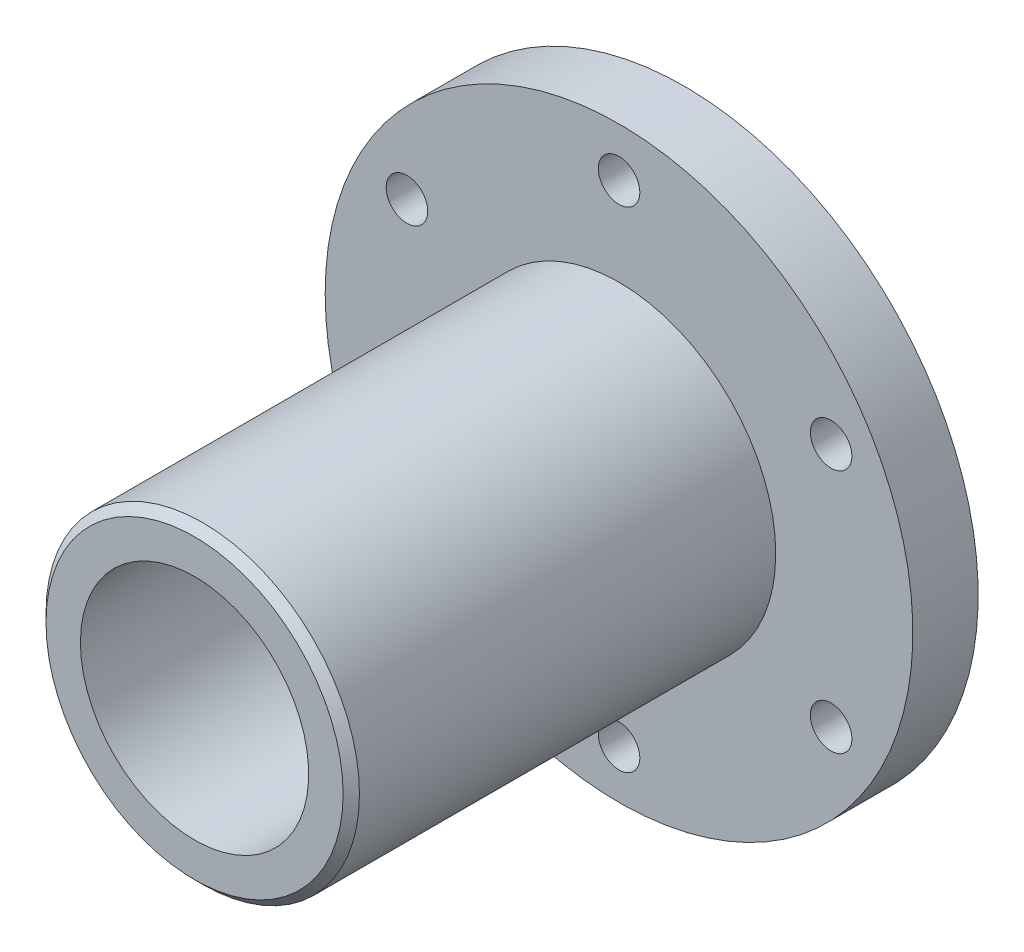
ISO-10303-21;
HEADER;
FILE_DESCRIPTION(('STEP AP214'),'2;1');
FILE_NAME('part.step','',(''),(''),'','','');
FILE_SCHEMA(('AUTOMOTIVE_DESIGN { 1 0 10303 214 1 1 1 1 }'));
ENDSEC;
DATA;
#1=APPLICATION_CONTEXT('core data for automotive mechanical design processes');
#2=APPLICATION_PROTOCOL_DEFINITION('international standard','automotive_design',2000,#1);
#3=PRODUCT_CONTEXT('',#1,'mechanical');
#4=PRODUCT('Part','Part','',(#3));
#5=PRODUCT_RELATED_PRODUCT_CATEGORY('part','',(#4));
#6=PRODUCT_DEFINITION_FORMATION('','',#4);
#7=PRODUCT_DEFINITION_CONTEXT('part definition',#1,'design');
#8=PRODUCT_DEFINITION('design','',#6,#7);
#9=PRODUCT_DEFINITION_SHAPE('','',#8);
#10=(LENGTH_UNIT() NAMED_UNIT(*) SI_UNIT(.MILLI.,.METRE.));
#11=(NAMED_UNIT(*) PLANE_ANGLE_UNIT() SI_UNIT($,.RADIAN.));
#12=(NAMED_UNIT(*) SI_UNIT($,.STERADIAN.) SOLID_ANGLE_UNIT());
#13=UNCERTAINTY_MEASURE_WITH_UNIT(LENGTH_MEASURE(1.E-05),#10,'distance_accuracy_value','');
#14=(GEOMETRIC_REPRESENTATION_CONTEXT(3) GLOBAL_UNCERTAINTY_ASSIGNED_CONTEXT((#13)) GLOBAL_UNIT_ASSIGNED_CONTEXT((#10,
#11,#12)) REPRESENTATION_CONTEXT('',''));
#15=CARTESIAN_POINT('',(0.,0.,0.));
#16=DIRECTION('',(0.,0.,1.));
#17=DIRECTION('',(1.,0.,0.));
#18=AXIS2_PLACEMENT_3D('',#15,#16,#17);
#19=CARTESIAN_POINT('',(0.,0.,43.65625));
#20=DIRECTION('',(0.,0.,-1.));
#21=DIRECTION('',(-1.,0.,0.));
#22=AXIS2_PLACEMENT_3D('',#19,#20,#21);
#23=CONICAL_SURFACE('',#22,15.24,0.785398163397449);
#24=CARTESIAN_POINT('',(0.,0.,43.65625));
#25=DIRECTION('',(0.,0.,-1.));
#26=DIRECTION('',(-1.,0.,0.));
#27=AXIS2_PLACEMENT_3D('',#24,#25,#26);
#28=CIRCLE('',#27,15.24);
#29=CARTESIAN_POINT('',(-15.24,0.,43.65625));
#30=VERTEX_POINT('',#29);
#31=EDGE_CURVE('E29',#30,#30,#28,.T.);
#32=ORIENTED_EDGE('',*,*,#31,.F.);
#33=EDGE_LOOP('',(#32));
#34=FACE_BOUND('',#33,.T.);
#35=CARTESIAN_POINT('',(0.,0.,44.45));
#36=DIRECTION('',(0.,0.,-1.));
#37=DIRECTION('',(-1.,0.,0.));
#38=AXIS2_PLACEMENT_3D('',#35,#36,#37);
#39=CIRCLE('',#38,14.44625);
#40=CARTESIAN_POINT('',(-14.44625,0.,44.45));
#41=VERTEX_POINT('',#40);
#42=EDGE_CURVE('E17',#41,#41,#39,.F.);
#43=ORIENTED_EDGE('',*,*,#42,.F.);
#44=EDGE_LOOP('',(#43));
#45=FACE_BOUND('',#44,.T.);
#46=ADVANCED_FACE('F14',(#34,#45),#23,.T.);
#47=CARTESIAN_POINT('',(0.,0.,44.45));
#48=DIRECTION('',(0.,0.,-1.));
#49=DIRECTION('',(-1.,0.,0.));
#50=AXIS2_PLACEMENT_3D('',#47,#48,#49);
#51=CYLINDRICAL_SURFACE('',#50,15.24);
#52=CARTESIAN_POINT('',(0.,0.,3.175));
#53=DIRECTION('',(0.,0.,-1.));
#54=DIRECTION('',(-1.,0.,0.));
#55=AXIS2_PLACEMENT_3D('',#52,#53,#54);
#56=CIRCLE('',#55,15.24);
#57=CARTESIAN_POINT('',(-15.24,0.,3.175));
#58=VERTEX_POINT('',#57);
#59=EDGE_CURVE('E71',#58,#58,#56,.T.);
#60=ORIENTED_EDGE('',*,*,#59,.F.);
#61=EDGE_LOOP('',(#60));
#62=FACE_BOUND('',#61,.T.);
#63=ORIENTED_EDGE('',*,*,#31,.T.);
#64=EDGE_LOOP('',(#63));
#65=FACE_BOUND('',#64,.T.);
#66=ADVANCED_FACE('F81',(#62,#65),#51,.T.);
#67=CARTESIAN_POINT('',(0.,0.,44.45));
#68=DIRECTION('',(0.,0.,1.));
#69=DIRECTION('',(1.,0.,0.));
#70=AXIS2_PLACEMENT_3D('',#67,#68,#69);
#71=PLANE('',#70);
#72=CARTESIAN_POINT('',(0.,0.,44.45));
#73=DIRECTION('',(0.,0.,-1.));
#74=DIRECTION('',(-1.,0.,0.));
#75=AXIS2_PLACEMENT_3D('',#72,#73,#74);
#76=CIRCLE('',#75,11.0998);
#77=CARTESIAN_POINT('',(-11.0998,0.,44.45));
#78=VERTEX_POINT('',#77);
#79=EDGE_CURVE('E63',#78,#78,#76,.T.);
#80=ORIENTED_EDGE('',*,*,#79,.T.);
#81=EDGE_LOOP('',(#80));
#82=FACE_BOUND('',#81,.T.);
#83=ORIENTED_EDGE('',*,*,#42,.T.);
#84=EDGE_LOOP('',(#83));
#85=FACE_BOUND('',#84,.T.);
#86=ADVANCED_FACE('F89',(#82,#85),#71,.T.);
#87=CARTESIAN_POINT('',(0.,0.,3.175));
#88=DIRECTION('',(0.,0.,1.));
#89=DIRECTION('',(1.,0.,0.));
#90=AXIS2_PLACEMENT_3D('',#87,#88,#89);
#91=PLANE('',#90);
#92=ORIENTED_EDGE('',*,*,#59,.T.);
#93=EDGE_LOOP('',(#92));
#94=FACE_BOUND('',#93,.T.);
#95=CARTESIAN_POINT('',(0.,0.,3.175));
#96=DIRECTION('',(0.,0.,-1.));
#97=DIRECTION('',(-1.,0.,0.));
#98=AXIS2_PLACEMENT_3D('',#95,#96,#97);
#99=CIRCLE('',#98,28.575);
#100=CARTESIAN_POINT('',(-28.575,0.,3.175));
#101=VERTEX_POINT('',#100);
#102=EDGE_CURVE('E60',#101,#101,#99,.T.);
#103=ORIENTED_EDGE('',*,*,#102,.F.);
#104=EDGE_LOOP('',(#103));
#105=FACE_BOUND('',#104,.T.);
#106=CARTESIAN_POINT('',(0.,23.8125,3.175));
#107=DIRECTION('',(0.,0.,-1.));
#108=DIRECTION('',(-1.,0.,0.));
#109=AXIS2_PLACEMENT_3D('',#106,#107,#108);
#110=CIRCLE('',#109,2.01929999999999);
#111=CARTESIAN_POINT('',(-2.01929999999999,23.8125,3.175));
#112=VERTEX_POINT('',#111);
#113=EDGE_CURVE('E57',#112,#112,#110,.T.);
#114=ORIENTED_EDGE('',*,*,#113,.T.);
#115=EDGE_LOOP('',(#114));
#116=FACE_BOUND('',#115,.T.);
#117=CARTESIAN_POINT('',(-20.622229927617,11.90625,3.175));
#118=DIRECTION('',(0.,0.,-1.));
#119=DIRECTION('',(-1.,0.,0.));
#120=AXIS2_PLACEMENT_3D('',#117,#118,#119);
#121=CIRCLE('',#120,2.01929999999999);
#122=CARTESIAN_POINT('',(-22.641529927617,11.90625,3.175));
#123=VERTEX_POINT('',#122);
#124=EDGE_CURVE('E54',#123,#123,#121,.T.);
#125=ORIENTED_EDGE('',*,*,#124,.T.);
#126=EDGE_LOOP('',(#125));
#127=FACE_BOUND('',#126,.T.);
#128=CARTESIAN_POINT('',(-20.6222299276169,-11.9062500000001,3.175));
#129=DIRECTION('',(0.,0.,-1.));
#130=DIRECTION('',(-1.,0.,0.));
#131=AXIS2_PLACEMENT_3D('',#128,#129,#130);
#132=CIRCLE('',#131,2.01929999999999);
#133=CARTESIAN_POINT('',(-22.6415299276169,-11.9062500000001,3.175));
#134=VERTEX_POINT('',#133);
#135=EDGE_CURVE('E51',#134,#134,#132,.T.);
#136=ORIENTED_EDGE('',*,*,#135,.T.);
#137=EDGE_LOOP('',(#136));
#138=FACE_BOUND('',#137,.T.);
#139=CARTESIAN_POINT('',(0.,-23.8125,3.175));
#140=DIRECTION('',(0.,0.,-1.));
#141=DIRECTION('',(-1.,0.,0.));
#142=AXIS2_PLACEMENT_3D('',#139,#140,#141);
#143=CIRCLE('',#142,2.01929999999999);
#144=CARTESIAN_POINT('',(-2.01929999999999,-23.8125,3.175));
#145=VERTEX_POINT('',#144);
#146=EDGE_CURVE('E48',#145,#145,#143,.T.);
#147=ORIENTED_EDGE('',*,*,#146,.T.);
#148=EDGE_LOOP('',(#147));
#149=FACE_BOUND('',#148,.T.);
#150=CARTESIAN_POINT('',(20.6222299276171,-11.9062499999998,3.175));
#151=DIRECTION('',(0.,0.,-1.));
#152=DIRECTION('',(-1.,0.,0.));
#153=AXIS2_PLACEMENT_3D('',#150,#151,#152);
#154=CIRCLE('',#153,2.01929999999999);
#155=CARTESIAN_POINT('',(18.6029299276171,-11.9062499999998,3.175));
#156=VERTEX_POINT('',#155);
#157=EDGE_CURVE('E66',#156,#156,#154,.T.);
#158=ORIENTED_EDGE('',*,*,#157,.T.);
#159=EDGE_LOOP('',(#158));
#160=FACE_BOUND('',#159,.T.);
#161=CARTESIAN_POINT('',(20.6222299276168,11.9062500000002,3.175));
#162=DIRECTION('',(0.,0.,-1.));
#163=DIRECTION('',(-1.,0.,0.));
#164=AXIS2_PLACEMENT_3D('',#161,#162,#163);
#165=CIRCLE('',#164,2.01929999999999);
#166=CARTESIAN_POINT('',(18.6029299276168,11.9062500000002,3.175));
#167=VERTEX_POINT('',#166);
#168=EDGE_CURVE('E69',#167,#167,#165,.T.);
#169=ORIENTED_EDGE('',*,*,#168,.T.);
#170=EDGE_LOOP('',(#169));
#171=FACE_BOUND('',#170,.T.);
#172=ADVANCED_FACE('F130',(#94,#105,#116,#127,#138,#149,#160,#171),#91,.T.);
#173=CARTESIAN_POINT('',(20.6222299276168,11.9062500000002,-3.175));
#174=DIRECTION('',(0.,0.,-1.));
#175=DIRECTION('',(-1.,0.,0.));
#176=AXIS2_PLACEMENT_3D('',#173,#174,#175);
#177=CYLINDRICAL_SURFACE('',#176,2.01929999999999);
#178=ORIENTED_EDGE('',*,*,#168,.F.);
#179=EDGE_LOOP('',(#178));
#180=FACE_BOUND('',#179,.T.);
#181=CARTESIAN_POINT('',(20.6222299276168,11.9062500000002,-3.175));
#182=DIRECTION('',(0.,0.,-1.));
#183=DIRECTION('',(-1.,0.,0.));
#184=AXIS2_PLACEMENT_3D('',#181,#182,#183);
#185=CIRCLE('',#184,2.01929999999999);
#186=CARTESIAN_POINT('',(18.6029299276168,11.9062500000002,-3.175));
#187=VERTEX_POINT('',#186);
#188=EDGE_CURVE('E45',#187,#187,#185,.T.);
#189=ORIENTED_EDGE('',*,*,#188,.T.);
#190=EDGE_LOOP('',(#189));
#191=FACE_BOUND('',#190,.T.);
#192=ADVANCED_FACE('F126',(#180,#191),#177,.F.);
#193=CARTESIAN_POINT('',(20.6222299276171,-11.9062499999998,-3.175));
#194=DIRECTION('',(0.,0.,-1.));
#195=DIRECTION('',(-1.,0.,0.));
#196=AXIS2_PLACEMENT_3D('',#193,#194,#195);
#197=CYLINDRICAL_SURFACE('',#196,2.01929999999999);
#198=ORIENTED_EDGE('',*,*,#157,.F.);
#199=EDGE_LOOP('',(#198));
#200=FACE_BOUND('',#199,.T.);
#201=CARTESIAN_POINT('',(20.6222299276171,-11.9062499999998,-3.175));
#202=DIRECTION('',(0.,0.,-1.));
#203=DIRECTION('',(-1.,0.,0.));
#204=AXIS2_PLACEMENT_3D('',#201,#202,#203);
#205=CIRCLE('',#204,2.01929999999999);
#206=CARTESIAN_POINT('',(18.6029299276171,-11.9062499999998,-3.175));
#207=VERTEX_POINT('',#206);
#208=EDGE_CURVE('E42',#207,#207,#205,.T.);
#209=ORIENTED_EDGE('',*,*,#208,.T.);
#210=EDGE_LOOP('',(#209));
#211=FACE_BOUND('',#210,.T.);
#212=ADVANCED_FACE('F122',(#200,#211),#197,.F.);
#213=CARTESIAN_POINT('',(0.,0.,3.175));
#214=DIRECTION('',(0.,0.,-1.));
#215=DIRECTION('',(-1.,0.,0.));
#216=AXIS2_PLACEMENT_3D('',#213,#214,#215);
#217=CYLINDRICAL_SURFACE('',#216,11.0998);
#218=CARTESIAN_POINT('',(0.,0.,-3.175));
#219=DIRECTION('',(0.,0.,-1.));
#220=DIRECTION('',(-1.,0.,0.));
#221=AXIS2_PLACEMENT_3D('',#218,#219,#220);
#222=CIRCLE('',#221,11.0998);
#223=CARTESIAN_POINT('',(-11.0998,0.,-3.175));
#224=VERTEX_POINT('',#223);
#225=EDGE_CURVE('E39',#224,#224,#222,.T.);
#226=ORIENTED_EDGE('',*,*,#225,.T.);
#227=EDGE_LOOP('',(#226));
#228=FACE_BOUND('',#227,.T.);
#229=ORIENTED_EDGE('',*,*,#79,.F.);
#230=EDGE_LOOP('',(#229));
#231=FACE_BOUND('',#230,.T.);
#232=ADVANCED_FACE('F118',(#228,#231),#217,.F.);
#233=CARTESIAN_POINT('',(0.,0.,3.175));
#234=DIRECTION('',(0.,0.,-1.));
#235=DIRECTION('',(-1.,0.,0.));
#236=AXIS2_PLACEMENT_3D('',#233,#234,#235);
#237=CYLINDRICAL_SURFACE('',#236,28.575);
#238=ORIENTED_EDGE('',*,*,#102,.T.);
#239=EDGE_LOOP('',(#238));
#240=FACE_BOUND('',#239,.T.);
#241=CARTESIAN_POINT('',(0.,0.,-3.175));
#242=DIRECTION('',(0.,0.,-1.));
#243=DIRECTION('',(-1.,0.,0.));
#244=AXIS2_PLACEMENT_3D('',#241,#242,#243);
#245=CIRCLE('',#244,28.575);
#246=CARTESIAN_POINT('',(-28.575,0.,-3.175));
#247=VERTEX_POINT('',#246);
#248=EDGE_CURVE('E36',#247,#247,#245,.F.);
#249=ORIENTED_EDGE('',*,*,#248,.T.);
#250=EDGE_LOOP('',(#249));
#251=FACE_BOUND('',#250,.T.);
#252=ADVANCED_FACE('F114',(#240,#251),#237,.T.);
#253=CARTESIAN_POINT('',(0.,23.8125,-3.175));
#254=DIRECTION('',(0.,0.,-1.));
#255=DIRECTION('',(-1.,0.,0.));
#256=AXIS2_PLACEMENT_3D('',#253,#254,#255);
#257=CYLINDRICAL_SURFACE('',#256,2.01929999999999);
#258=ORIENTED_EDGE('',*,*,#113,.F.);
#259=EDGE_LOOP('',(#258));
#260=FACE_BOUND('',#259,.T.);
#261=CARTESIAN_POINT('',(0.,23.8125,-3.175));
#262=DIRECTION('',(0.,0.,-1.));
#263=DIRECTION('',(-1.,0.,0.));
#264=AXIS2_PLACEMENT_3D('',#261,#262,#263);
#265=CIRCLE('',#264,2.01929999999999);
#266=CARTESIAN_POINT('',(-2.01929999999999,23.8125,-3.175));
#267=VERTEX_POINT('',#266);
#268=EDGE_CURVE('E33',#267,#267,#265,.T.);
#269=ORIENTED_EDGE('',*,*,#268,.T.);
#270=EDGE_LOOP('',(#269));
#271=FACE_BOUND('',#270,.T.);
#272=ADVANCED_FACE('F110',(#260,#271),#257,.F.);
#273=CARTESIAN_POINT('',(-20.622229927617,11.90625,-3.175));
#274=DIRECTION('',(0.,0.,-1.));
#275=DIRECTION('',(-1.,0.,0.));
#276=AXIS2_PLACEMENT_3D('',#273,#274,#275);
#277=CYLINDRICAL_SURFACE('',#276,2.01929999999999);
#278=ORIENTED_EDGE('',*,*,#124,.F.);
#279=EDGE_LOOP('',(#278));
#280=FACE_BOUND('',#279,.T.);
#281=CARTESIAN_POINT('',(-20.622229927617,11.90625,-3.175));
#282=DIRECTION('',(0.,0.,-1.));
#283=DIRECTION('',(-1.,0.,0.));
#284=AXIS2_PLACEMENT_3D('',#281,#282,#283);
#285=CIRCLE('',#284,2.01929999999999);
#286=CARTESIAN_POINT('',(-22.641529927617,11.90625,-3.175));
#287=VERTEX_POINT('',#286);
#288=EDGE_CURVE('E26',#287,#287,#285,.T.);
#289=ORIENTED_EDGE('',*,*,#288,.T.);
#290=EDGE_LOOP('',(#289));
#291=FACE_BOUND('',#290,.T.);
#292=ADVANCED_FACE('F106',(#280,#291),#277,.F.);
#293=CARTESIAN_POINT('',(-20.6222299276169,-11.9062500000001,-3.175));
#294=DIRECTION('',(0.,0.,-1.));
#295=DIRECTION('',(-1.,0.,0.));
#296=AXIS2_PLACEMENT_3D('',#293,#294,#295);
#297=CYLINDRICAL_SURFACE('',#296,2.01929999999999);
#298=ORIENTED_EDGE('',*,*,#135,.F.);
#299=EDGE_LOOP('',(#298));
#300=FACE_BOUND('',#299,.T.);
#301=CARTESIAN_POINT('',(-20.6222299276169,-11.9062500000001,-3.175));
#302=DIRECTION('',(0.,0.,-1.));
#303=DIRECTION('',(-1.,0.,0.));
#304=AXIS2_PLACEMENT_3D('',#301,#302,#303);
#305=CIRCLE('',#304,2.01929999999999);
#306=CARTESIAN_POINT('',(-22.6415299276169,-11.9062500000001,-3.175));
#307=VERTEX_POINT('',#306);
#308=EDGE_CURVE('E21',#307,#307,#305,.T.);
#309=ORIENTED_EDGE('',*,*,#308,.T.);
#310=EDGE_LOOP('',(#309));
#311=FACE_BOUND('',#310,.T.);
#312=ADVANCED_FACE('F99',(#300,#311),#297,.F.);
#313=CARTESIAN_POINT('',(0.,-23.8125,-3.175));
#314=DIRECTION('',(0.,0.,-1.));
#315=DIRECTION('',(-1.,0.,0.));
#316=AXIS2_PLACEMENT_3D('',#313,#314,#315);
#317=CYLINDRICAL_SURFACE('',#316,2.01929999999999);
#318=ORIENTED_EDGE('',*,*,#146,.F.);
#319=EDGE_LOOP('',(#318));
#320=FACE_BOUND('',#319,.T.);
#321=CARTESIAN_POINT('',(0.,-23.8125,-3.175));
#322=DIRECTION('',(0.,0.,-1.));
#323=DIRECTION('',(-1.,0.,0.));
#324=AXIS2_PLACEMENT_3D('',#321,#322,#323);
#325=CIRCLE('',#324,2.01929999999999);
#326=CARTESIAN_POINT('',(-2.01929999999999,-23.8125,-3.175));
#327=VERTEX_POINT('',#326);
#328=EDGE_CURVE('E9',#327,#327,#325,.T.);
#329=ORIENTED_EDGE('',*,*,#328,.T.);
#330=EDGE_LOOP('',(#329));
#331=FACE_BOUND('',#330,.T.);
#332=ADVANCED_FACE('F93',(#320,#331),#317,.F.);
#333=CARTESIAN_POINT('',(0.,0.,-3.175));
#334=DIRECTION('',(0.,0.,1.));
#335=DIRECTION('',(1.,0.,0.));
#336=AXIS2_PLACEMENT_3D('',#333,#334,#335);
#337=PLANE('',#336);
#338=ORIENTED_EDGE('',*,*,#328,.F.);
#339=EDGE_LOOP('',(#338));
#340=FACE_BOUND('',#339,.T.);
#341=ORIENTED_EDGE('',*,*,#308,.F.);
#342=EDGE_LOOP('',(#341));
#343=FACE_BOUND('',#342,.T.);
#344=ORIENTED_EDGE('',*,*,#288,.F.);
#345=EDGE_LOOP('',(#344));
#346=FACE_BOUND('',#345,.T.);
#347=ORIENTED_EDGE('',*,*,#268,.F.);
#348=EDGE_LOOP('',(#347));
#349=FACE_BOUND('',#348,.T.);
#350=ORIENTED_EDGE('',*,*,#248,.F.);
#351=EDGE_LOOP('',(#350));
#352=FACE_BOUND('',#351,.T.);
#353=ORIENTED_EDGE('',*,*,#225,.F.);
#354=EDGE_LOOP('',(#353));
#355=FACE_BOUND('',#354,.T.);
#356=ORIENTED_EDGE('',*,*,#208,.F.);
#357=EDGE_LOOP('',(#356));
#358=FACE_BOUND('',#357,.T.);
#359=ORIENTED_EDGE('',*,*,#188,.F.);
#360=EDGE_LOOP('',(#359));
#361=FACE_BOUND('',#360,.T.);
#362=ADVANCED_FACE('F91',(#340,#343,#346,#349,#352,#355,#358,#361),#337,.F.);
#363=CLOSED_SHELL('',(#46,#66,#86,#172,#192,#212,#232,#252,#272,#292,#312,#332,#362));
#364=MANIFOLD_SOLID_BREP('B1',#363);
#365=ADVANCED_BREP_SHAPE_REPRESENTATION('',(#18,#364),#14);
#366=SHAPE_DEFINITION_REPRESENTATION(#9,#365);
ENDSEC;
END-ISO-10303-21;
